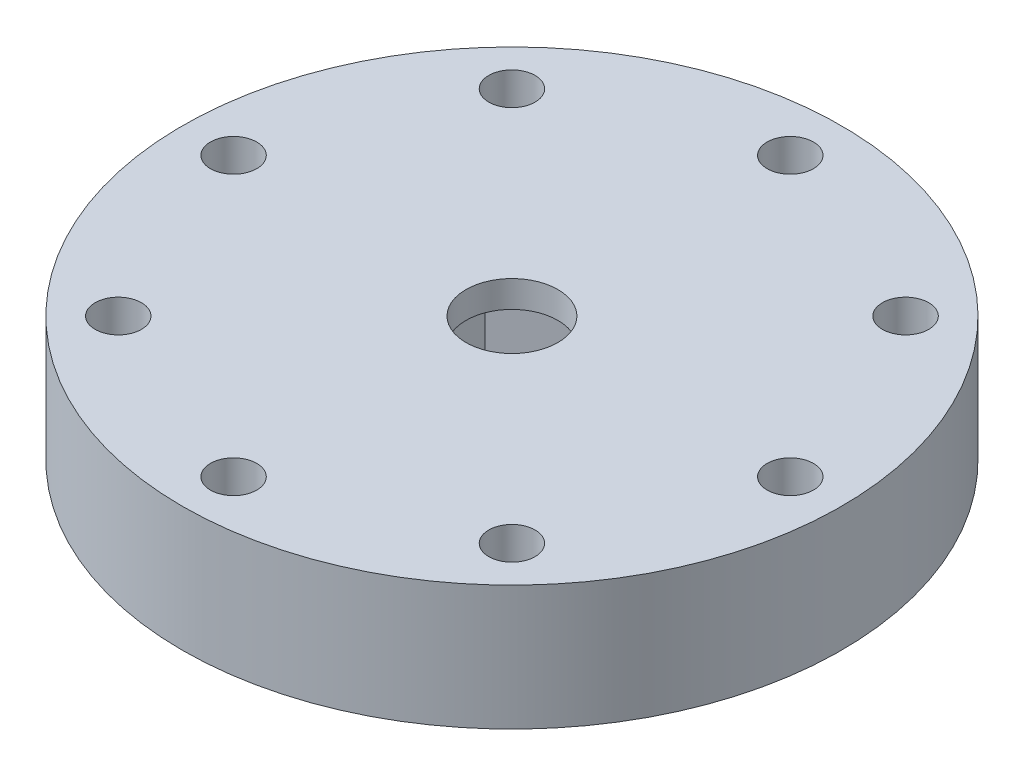
ISO-10303-21;
HEADER;
FILE_DESCRIPTION(('STEP AP214'),'2;1');
FILE_NAME('part.step','',(''),(''),'','','');
FILE_SCHEMA(('AUTOMOTIVE_DESIGN { 1 0 10303 214 1 1 1 1 }'));
ENDSEC;
DATA;
#1=APPLICATION_CONTEXT('core data for automotive mechanical design processes');
#2=APPLICATION_PROTOCOL_DEFINITION('international standard','automotive_design',2000,#1);
#3=PRODUCT_CONTEXT('',#1,'mechanical');
#4=PRODUCT('Part','Part','',(#3));
#5=PRODUCT_RELATED_PRODUCT_CATEGORY('part','',(#4));
#6=PRODUCT_DEFINITION_FORMATION('','',#4);
#7=PRODUCT_DEFINITION_CONTEXT('part definition',#1,'design');
#8=PRODUCT_DEFINITION('design','',#6,#7);
#9=PRODUCT_DEFINITION_SHAPE('','',#8);
#10=(LENGTH_UNIT() NAMED_UNIT(*) SI_UNIT(.MILLI.,.METRE.));
#11=(NAMED_UNIT(*) PLANE_ANGLE_UNIT() SI_UNIT($,.RADIAN.));
#12=(NAMED_UNIT(*) SI_UNIT($,.STERADIAN.) SOLID_ANGLE_UNIT());
#13=UNCERTAINTY_MEASURE_WITH_UNIT(LENGTH_MEASURE(1.E-05),#10,'distance_accuracy_value','');
#14=(GEOMETRIC_REPRESENTATION_CONTEXT(3) GLOBAL_UNCERTAINTY_ASSIGNED_CONTEXT((#13)) GLOBAL_UNIT_ASSIGNED_CONTEXT((#10,
#11,#12)) REPRESENTATION_CONTEXT('',''));
#15=CARTESIAN_POINT('',(0.,0.,0.));
#16=DIRECTION('',(0.,0.,1.));
#17=DIRECTION('',(1.,0.,0.));
#18=AXIS2_PLACEMENT_3D('',#15,#16,#17);
#19=CARTESIAN_POINT('',(0.,0.,0.));
#20=DIRECTION('',(0.,-1.,0.));
#21=DIRECTION('',(0.,0.,-1.));
#22=AXIS2_PLACEMENT_3D('',#19,#20,#21);
#23=CYLINDRICAL_SURFACE('',#22,5.15874);
#24=CARTESIAN_POINT('',(0.,14.,0.));
#25=DIRECTION('',(0.,-1.,0.));
#26=DIRECTION('',(0.,0.,-1.));
#27=AXIS2_PLACEMENT_3D('',#24,#25,#26);
#28=CIRCLE('',#27,5.15874);
#29=CARTESIAN_POINT('',(0.,14.,-5.15874));
#30=VERTEX_POINT('',#29);
#31=EDGE_CURVE('E158',#30,#30,#28,.T.);
#32=ORIENTED_EDGE('',*,*,#31,.F.);
#33=EDGE_LOOP('',(#32));
#34=FACE_BOUND('',#33,.T.);
#35=CARTESIAN_POINT('',(0.,11.,0.));
#36=DIRECTION('',(0.,-1.,0.));
#37=DIRECTION('',(0.,0.,-1.));
#38=AXIS2_PLACEMENT_3D('',#35,#36,#37);
#39=CIRCLE('',#38,5.15874);
#40=CARTESIAN_POINT('',(0.,11.,-5.15874));
#41=VERTEX_POINT('',#40);
#42=EDGE_CURVE('E140',#41,#41,#39,.F.);
#43=ORIENTED_EDGE('',*,*,#42,.F.);
#44=EDGE_LOOP('',(#43));
#45=FACE_BOUND('',#44,.T.);
#46=ADVANCED_FACE('F35',(#34,#45),#23,.F.);
#47=CARTESIAN_POINT('',(0.,0.,0.));
#48=DIRECTION('',(0.,1.,0.));
#49=DIRECTION('',(0.,0.,1.));
#50=AXIS2_PLACEMENT_3D('',#47,#48,#49);
#51=PLANE('',#50);
#52=CARTESIAN_POINT('',(0.,0.,0.));
#53=DIRECTION('',(0.,1.,0.));
#54=DIRECTION('',(0.,0.,1.));
#55=AXIS2_PLACEMENT_3D('',#52,#53,#54);
#56=CIRCLE('',#55,27.6);
#57=CARTESIAN_POINT('',(0.,0.,27.6));
#58=VERTEX_POINT('',#57);
#59=EDGE_CURVE('E165',#58,#58,#56,.F.);
#60=ORIENTED_EDGE('',*,*,#59,.T.);
#61=EDGE_LOOP('',(#60));
#62=FACE_BOUND('',#61,.T.);
#63=CARTESIAN_POINT('',(0.,0.,0.));
#64=DIRECTION('',(0.,-1.,0.));
#65=DIRECTION('',(0.,0.,-1.));
#66=AXIS2_PLACEMENT_3D('',#63,#64,#65);
#67=CIRCLE('',#66,22.5);
#68=CARTESIAN_POINT('',(0.,0.,-22.5));
#69=VERTEX_POINT('',#68);
#70=EDGE_CURVE('E150',#69,#69,#67,.T.);
#71=ORIENTED_EDGE('',*,*,#70,.F.);
#72=EDGE_LOOP('',(#71));
#73=FACE_BOUND('',#72,.T.);
#74=ADVANCED_FACE('F195',(#62,#73),#51,.F.);
#75=CARTESIAN_POINT('',(0.,14.,0.));
#76=DIRECTION('',(0.,1.,0.));
#77=DIRECTION('',(0.,0.,1.));
#78=AXIS2_PLACEMENT_3D('',#75,#76,#77);
#79=PLANE('',#78);
#80=CARTESIAN_POINT('',(-22.0970869120793,14.,-22.0970869120799));
#81=DIRECTION('',(0.,-1.,0.));
#82=DIRECTION('',(-0.707106781186539,0.,-0.707106781186556));
#83=AXIS2_PLACEMENT_3D('',#80,#81,#82);
#84=CIRCLE('',#83,2.6);
#85=CARTESIAN_POINT('',(-23.9355645431643,14.,-23.9355645431649));
#86=VERTEX_POINT('',#85);
#87=EDGE_CURVE('E376',#86,#86,#84,.T.);
#88=ORIENTED_EDGE('',*,*,#87,.T.);
#89=EDGE_LOOP('',(#88));
#90=FACE_BOUND('',#89,.T.);
#91=CARTESIAN_POINT('',(-31.25,14.,-3.27326375516544E-13));
#92=DIRECTION('',(0.,-1.,0.));
#93=DIRECTION('',(-1.,0.,0.));
#94=AXIS2_PLACEMENT_3D('',#91,#92,#93);
#95=CIRCLE('',#94,2.6);
#96=CARTESIAN_POINT('',(-33.85,14.,-3.5455992995952E-13));
#97=VERTEX_POINT('',#96);
#98=EDGE_CURVE('E388',#97,#97,#95,.T.);
#99=ORIENTED_EDGE('',*,*,#98,.T.);
#100=EDGE_LOOP('',(#99));
#101=FACE_BOUND('',#100,.T.);
#102=CARTESIAN_POINT('',(-22.0970869120798,14.,22.0970869120794));
#103=DIRECTION('',(0.,-1.,0.));
#104=DIRECTION('',(-0.707106781186554,0.,0.707106781186541));
#105=AXIS2_PLACEMENT_3D('',#102,#103,#104);
#106=CIRCLE('',#105,2.6);
#107=CARTESIAN_POINT('',(-23.9355645431648,14.,23.9355645431644));
#108=VERTEX_POINT('',#107);
#109=EDGE_CURVE('E400',#108,#108,#106,.T.);
#110=ORIENTED_EDGE('',*,*,#109,.T.);
#111=EDGE_LOOP('',(#110));
#112=FACE_BOUND('',#111,.T.);
#113=CARTESIAN_POINT('',(0.,14.,31.25));
#114=DIRECTION('',(0.,-1.,0.));
#115=DIRECTION('',(0.,0.,1.));
#116=AXIS2_PLACEMENT_3D('',#113,#114,#115);
#117=CIRCLE('',#116,2.6);
#118=CARTESIAN_POINT('',(0.,14.,33.85));
#119=VERTEX_POINT('',#118);
#120=EDGE_CURVE('E412',#119,#119,#117,.T.);
#121=ORIENTED_EDGE('',*,*,#120,.T.);
#122=EDGE_LOOP('',(#121));
#123=FACE_BOUND('',#122,.T.);
#124=CARTESIAN_POINT('',(22.0970869120795,14.,22.0970869120797));
#125=DIRECTION('',(0.,-1.,0.));
#126=DIRECTION('',(0.707106781186544,0.,0.707106781186551));
#127=AXIS2_PLACEMENT_3D('',#124,#125,#126);
#128=CIRCLE('',#127,2.6);
#129=CARTESIAN_POINT('',(23.9355645431645,14.,23.9355645431648));
#130=VERTEX_POINT('',#129);
#131=EDGE_CURVE('E424',#130,#130,#128,.T.);
#132=ORIENTED_EDGE('',*,*,#131,.T.);
#133=EDGE_LOOP('',(#132));
#134=FACE_BOUND('',#133,.T.);
#135=CARTESIAN_POINT('',(31.25,14.,1.09108791838848E-13));
#136=DIRECTION('',(0.,-1.,0.));
#137=DIRECTION('',(1.,0.,0.));
#138=AXIS2_PLACEMENT_3D('',#135,#136,#137);
#139=CIRCLE('',#138,2.6);
#140=CARTESIAN_POINT('',(33.85,14.,1.1818664331984E-13));
#141=VERTEX_POINT('',#140);
#142=EDGE_CURVE('E436',#141,#141,#139,.T.);
#143=ORIENTED_EDGE('',*,*,#142,.T.);
#144=EDGE_LOOP('',(#143));
#145=FACE_BOUND('',#144,.T.);
#146=CARTESIAN_POINT('',(22.0970869120797,14.,-22.0970869120796));
#147=DIRECTION('',(0.,-1.,0.));
#148=DIRECTION('',(0.707106781186549,0.,-0.707106781186546));
#149=AXIS2_PLACEMENT_3D('',#146,#147,#148);
#150=CIRCLE('',#149,2.6);
#151=CARTESIAN_POINT('',(23.9355645431647,14.,-23.9355645431646));
#152=VERTEX_POINT('',#151);
#153=EDGE_CURVE('E448',#152,#152,#150,.T.);
#154=ORIENTED_EDGE('',*,*,#153,.T.);
#155=EDGE_LOOP('',(#154));
#156=FACE_BOUND('',#155,.T.);
#157=CARTESIAN_POINT('',(0.,14.,-31.25));
#158=DIRECTION('',(0.,-1.,0.));
#159=DIRECTION('',(0.,0.,-1.));
#160=AXIS2_PLACEMENT_3D('',#157,#158,#159);
#161=CIRCLE('',#160,2.6);
#162=CARTESIAN_POINT('',(0.,14.,-33.85));
#163=VERTEX_POINT('',#162);
#164=EDGE_CURVE('E127',#163,#163,#161,.T.);
#165=ORIENTED_EDGE('',*,*,#164,.T.);
#166=EDGE_LOOP('',(#165));
#167=FACE_BOUND('',#166,.T.);
#168=ORIENTED_EDGE('',*,*,#31,.T.);
#169=EDGE_LOOP('',(#168));
#170=FACE_BOUND('',#169,.T.);
#171=CARTESIAN_POINT('',(0.,14.,0.));
#172=DIRECTION('',(0.,1.,0.));
#173=DIRECTION('',(0.,0.,1.));
#174=AXIS2_PLACEMENT_3D('',#171,#172,#173);
#175=CIRCLE('',#174,37.);
#176=CARTESIAN_POINT('',(0.,14.,37.));
#177=VERTEX_POINT('',#176);
#178=EDGE_CURVE('E162',#177,#177,#175,.T.);
#179=ORIENTED_EDGE('',*,*,#178,.T.);
#180=EDGE_LOOP('',(#179));
#181=FACE_BOUND('',#180,.T.);
#182=ADVANCED_FACE('F201',(#90,#101,#112,#123,#134,#145,#156,#167,#170,#181),#79,.T.);
#183=CARTESIAN_POINT('',(0.,0.,0.));
#184=DIRECTION('',(0.,1.,0.));
#185=DIRECTION('',(0.,0.,1.));
#186=AXIS2_PLACEMENT_3D('',#183,#184,#185);
#187=CIRCLE('',#186,34.9);
#188=CARTESIAN_POINT('',(0.,0.,34.9));
#189=VERTEX_POINT('',#188);
#190=EDGE_CURVE('E11',#189,#189,#187,.T.);
#191=ORIENTED_EDGE('',*,*,#190,.T.);
#192=EDGE_LOOP('',(#191));
#193=FACE_BOUND('',#192,.T.);
#194=CARTESIAN_POINT('',(0.,0.,0.));
#195=DIRECTION('',(0.,1.,0.));
#196=DIRECTION('',(0.,0.,1.));
#197=AXIS2_PLACEMENT_3D('',#194,#195,#196);
#198=CIRCLE('',#197,37.);
#199=CARTESIAN_POINT('',(0.,0.,37.));
#200=VERTEX_POINT('',#199);
#201=EDGE_CURVE('E161',#200,#200,#198,.T.);
#202=ORIENTED_EDGE('',*,*,#201,.F.);
#203=EDGE_LOOP('',(#202));
#204=FACE_BOUND('',#203,.T.);
#205=ADVANCED_FACE('F204',(#193,#204),#51,.F.);
#206=CARTESIAN_POINT('',(0.,14.,0.));
#207=DIRECTION('',(0.,-1.,0.));
#208=DIRECTION('',(0.,0.,-1.));
#209=AXIS2_PLACEMENT_3D('',#206,#207,#208);
#210=CYLINDRICAL_SURFACE('',#209,37.);
#211=ORIENTED_EDGE('',*,*,#178,.F.);
#212=EDGE_LOOP('',(#211));
#213=FACE_BOUND('',#212,.T.);
#214=ORIENTED_EDGE('',*,*,#201,.T.);
#215=EDGE_LOOP('',(#214));
#216=FACE_BOUND('',#215,.T.);
#217=ADVANCED_FACE('F214',(#213,#216),#210,.T.);
#218=CARTESIAN_POINT('',(0.,3.,0.));
#219=DIRECTION('',(0.,-1.,0.));
#220=DIRECTION('',(0.,0.,-1.));
#221=AXIS2_PLACEMENT_3D('',#218,#219,#220);
#222=CYLINDRICAL_SURFACE('',#221,34.1);
#223=CARTESIAN_POINT('',(0.,0.800000000000023,0.));
#224=DIRECTION('',(0.,1.,0.));
#225=DIRECTION('',(0.,0.,1.));
#226=AXIS2_PLACEMENT_3D('',#223,#224,#225);
#227=CIRCLE('',#226,34.1);
#228=CARTESIAN_POINT('',(0.,0.800000000000023,34.1));
#229=VERTEX_POINT('',#228);
#230=EDGE_CURVE('E44',#229,#229,#227,.F.);
#231=ORIENTED_EDGE('',*,*,#230,.T.);
#232=EDGE_LOOP('',(#231));
#233=FACE_BOUND('',#232,.T.);
#234=CARTESIAN_POINT('',(0.,3.,0.));
#235=DIRECTION('',(0.,-1.,0.));
#236=DIRECTION('',(0.,0.,-1.));
#237=AXIS2_PLACEMENT_3D('',#234,#235,#236);
#238=CIRCLE('',#237,34.1);
#239=CARTESIAN_POINT('',(0.,3.,-34.1));
#240=VERTEX_POINT('',#239);
#241=EDGE_CURVE('E155',#240,#240,#238,.T.);
#242=ORIENTED_EDGE('',*,*,#241,.F.);
#243=EDGE_LOOP('',(#242));
#244=FACE_BOUND('',#243,.T.);
#245=ADVANCED_FACE('F177',(#233,#244),#222,.F.);
#246=CARTESIAN_POINT('',(0.,3.,0.));
#247=DIRECTION('',(0.,-1.,0.));
#248=DIRECTION('',(0.,0.,-1.));
#249=AXIS2_PLACEMENT_3D('',#246,#247,#248);
#250=PLANE('',#249);
#251=CARTESIAN_POINT('',(-22.0970869120793,3.,-22.0970869120799));
#252=DIRECTION('',(0.,-1.,0.));
#253=DIRECTION('',(-0.707106781186539,0.,-0.707106781186556));
#254=AXIS2_PLACEMENT_3D('',#251,#252,#253);
#255=CIRCLE('',#254,1.7);
#256=CARTESIAN_POINT('',(-23.2991684400965,3.,-23.299168440097));
#257=VERTEX_POINT('',#256);
#258=EDGE_CURVE('E369',#257,#257,#255,.T.);
#259=ORIENTED_EDGE('',*,*,#258,.F.);
#260=EDGE_LOOP('',(#259));
#261=FACE_BOUND('',#260,.T.);
#262=CARTESIAN_POINT('',(-31.25,3.,-3.27326375516544E-13));
#263=DIRECTION('',(0.,-1.,0.));
#264=DIRECTION('',(-1.,0.,0.));
#265=AXIS2_PLACEMENT_3D('',#262,#263,#264);
#266=CIRCLE('',#265,1.7);
#267=CARTESIAN_POINT('',(-32.95,3.,-3.45132930344644E-13));
#268=VERTEX_POINT('',#267);
#269=EDGE_CURVE('E379',#268,#268,#266,.T.);
#270=ORIENTED_EDGE('',*,*,#269,.F.);
#271=EDGE_LOOP('',(#270));
#272=FACE_BOUND('',#271,.T.);
#273=CARTESIAN_POINT('',(-22.0970869120798,3.,22.0970869120794));
#274=DIRECTION('',(0.,-1.,0.));
#275=DIRECTION('',(-0.707106781186554,0.,0.707106781186541));
#276=AXIS2_PLACEMENT_3D('',#273,#274,#275);
#277=CIRCLE('',#276,1.7);
#278=CARTESIAN_POINT('',(-23.2991684400969,3.,23.2991684400965));
#279=VERTEX_POINT('',#278);
#280=EDGE_CURVE('E391',#279,#279,#277,.T.);
#281=ORIENTED_EDGE('',*,*,#280,.F.);
#282=EDGE_LOOP('',(#281));
#283=FACE_BOUND('',#282,.T.);
#284=CARTESIAN_POINT('',(0.,3.,31.25));
#285=DIRECTION('',(0.,-1.,0.));
#286=DIRECTION('',(0.,0.,1.));
#287=AXIS2_PLACEMENT_3D('',#284,#285,#286);
#288=CIRCLE('',#287,1.7);
#289=CARTESIAN_POINT('',(0.,3.,32.95));
#290=VERTEX_POINT('',#289);
#291=EDGE_CURVE('E403',#290,#290,#288,.T.);
#292=ORIENTED_EDGE('',*,*,#291,.F.);
#293=EDGE_LOOP('',(#292));
#294=FACE_BOUND('',#293,.T.);
#295=CARTESIAN_POINT('',(22.0970869120795,3.,22.0970869120797));
#296=DIRECTION('',(0.,-1.,0.));
#297=DIRECTION('',(0.707106781186544,0.,0.707106781186551));
#298=AXIS2_PLACEMENT_3D('',#295,#296,#297);
#299=CIRCLE('',#298,1.7);
#300=CARTESIAN_POINT('',(23.2991684400966,3.,23.2991684400969));
#301=VERTEX_POINT('',#300);
#302=EDGE_CURVE('E415',#301,#301,#299,.T.);
#303=ORIENTED_EDGE('',*,*,#302,.F.);
#304=EDGE_LOOP('',(#303));
#305=FACE_BOUND('',#304,.T.);
#306=CARTESIAN_POINT('',(31.25,3.,1.09108791838848E-13));
#307=DIRECTION('',(0.,-1.,0.));
#308=DIRECTION('',(1.,0.,0.));
#309=AXIS2_PLACEMENT_3D('',#306,#307,#308);
#310=CIRCLE('',#309,1.7);
#311=CARTESIAN_POINT('',(32.95,3.,1.15044310114881E-13));
#312=VERTEX_POINT('',#311);
#313=EDGE_CURVE('E427',#312,#312,#310,.T.);
#314=ORIENTED_EDGE('',*,*,#313,.F.);
#315=EDGE_LOOP('',(#314));
#316=FACE_BOUND('',#315,.T.);
#317=CARTESIAN_POINT('',(22.0970869120797,3.,-22.0970869120796));
#318=DIRECTION('',(0.,-1.,0.));
#319=DIRECTION('',(0.707106781186549,0.,-0.707106781186546));
#320=AXIS2_PLACEMENT_3D('',#317,#318,#319);
#321=CIRCLE('',#320,1.7);
#322=CARTESIAN_POINT('',(23.2991684400968,3.,-23.2991684400967));
#323=VERTEX_POINT('',#322);
#324=EDGE_CURVE('E439',#323,#323,#321,.T.);
#325=ORIENTED_EDGE('',*,*,#324,.F.);
#326=EDGE_LOOP('',(#325));
#327=FACE_BOUND('',#326,.T.);
#328=CARTESIAN_POINT('',(0.,3.,-31.25));
#329=DIRECTION('',(0.,-1.,0.));
#330=DIRECTION('',(0.,0.,-1.));
#331=AXIS2_PLACEMENT_3D('',#328,#329,#330);
#332=CIRCLE('',#331,1.7);
#333=CARTESIAN_POINT('',(0.,3.,-32.95));
#334=VERTEX_POINT('',#333);
#335=EDGE_CURVE('E451',#334,#334,#332,.T.);
#336=ORIENTED_EDGE('',*,*,#335,.F.);
#337=EDGE_LOOP('',(#336));
#338=FACE_BOUND('',#337,.T.);
#339=CARTESIAN_POINT('',(0.,3.,0.));
#340=DIRECTION('',(0.,-1.,0.));
#341=DIRECTION('',(0.,0.,-1.));
#342=AXIS2_PLACEMENT_3D('',#339,#340,#341);
#343=CIRCLE('',#342,28.4);
#344=CARTESIAN_POINT('',(0.,3.,-28.4));
#345=VERTEX_POINT('',#344);
#346=EDGE_CURVE('E149',#345,#345,#343,.T.);
#347=ORIENTED_EDGE('',*,*,#346,.F.);
#348=EDGE_LOOP('',(#347));
#349=FACE_BOUND('',#348,.T.);
#350=ORIENTED_EDGE('',*,*,#241,.T.);
#351=EDGE_LOOP('',(#350));
#352=FACE_BOUND('',#351,.T.);
#353=ADVANCED_FACE('F226',(#261,#272,#283,#294,#305,#316,#327,#338,#349,#352),#250,.T.);
#354=CARTESIAN_POINT('',(0.,3.,0.));
#355=DIRECTION('',(0.,-1.,0.));
#356=DIRECTION('',(0.,0.,-1.));
#357=AXIS2_PLACEMENT_3D('',#354,#355,#356);
#358=CYLINDRICAL_SURFACE('',#357,28.4);
#359=CARTESIAN_POINT('',(0.,0.800000000000012,0.));
#360=DIRECTION('',(0.,1.,0.));
#361=DIRECTION('',(0.,0.,1.));
#362=AXIS2_PLACEMENT_3D('',#359,#360,#361);
#363=CIRCLE('',#362,28.4);
#364=CARTESIAN_POINT('',(0.,0.800000000000012,28.4));
#365=VERTEX_POINT('',#364);
#366=EDGE_CURVE('E172',#365,#365,#363,.T.);
#367=ORIENTED_EDGE('',*,*,#366,.T.);
#368=EDGE_LOOP('',(#367));
#369=FACE_BOUND('',#368,.T.);
#370=ORIENTED_EDGE('',*,*,#346,.T.);
#371=EDGE_LOOP('',(#370));
#372=FACE_BOUND('',#371,.T.);
#373=ADVANCED_FACE('F235',(#369,#372),#358,.T.);
#374=CARTESIAN_POINT('',(0.,5.,0.));
#375=DIRECTION('',(0.,-1.,0.));
#376=DIRECTION('',(0.,0.,-1.));
#377=AXIS2_PLACEMENT_3D('',#374,#375,#376);
#378=PLANE('',#377);
#379=DIRECTION('',(-0.866025403784439,0.,0.5));
#380=VECTOR('',#379,1.);
#381=CARTESIAN_POINT('',(7.14375,5.,4.12444598552339));
#382=LINE('',#381,#380);
#383=CARTESIAN_POINT('',(7.14375,5.,4.12444598552339));
#384=VERTEX_POINT('',#383);
#385=CARTESIAN_POINT('',(0.,5.,8.24889197104678));
#386=VERTEX_POINT('',#385);
#387=EDGE_CURVE('E51',#384,#386,#382,.T.);
#388=ORIENTED_EDGE('',*,*,#387,.F.);
#389=DIRECTION('',(0.,0.,1.));
#390=VECTOR('',#389,1.);
#391=CARTESIAN_POINT('',(7.14375,5.,-4.1244459855234));
#392=LINE('',#391,#390);
#393=CARTESIAN_POINT('',(7.14375,5.,-4.1244459855234));
#394=VERTEX_POINT('',#393);
#395=EDGE_CURVE('E136',#394,#384,#392,.T.);
#396=ORIENTED_EDGE('',*,*,#395,.F.);
#397=DIRECTION('',(0.866025403784439,0.,0.5));
#398=VECTOR('',#397,1.);
#399=CARTESIAN_POINT('',(0.,5.,-8.24889197104678));
#400=LINE('',#399,#398);
#401=CARTESIAN_POINT('',(0.,5.,-8.24889197104678));
#402=VERTEX_POINT('',#401);
#403=EDGE_CURVE('E134',#402,#394,#400,.T.);
#404=ORIENTED_EDGE('',*,*,#403,.F.);
#405=DIRECTION('',(0.866025403784438,0.,-0.5));
#406=VECTOR('',#405,1.);
#407=CARTESIAN_POINT('',(-7.14375,5.,-4.12444598552339));
#408=LINE('',#407,#406);
#409=CARTESIAN_POINT('',(-7.14375,5.,-4.12444598552339));
#410=VERTEX_POINT('',#409);
#411=EDGE_CURVE('E99',#410,#402,#408,.T.);
#412=ORIENTED_EDGE('',*,*,#411,.F.);
#413=DIRECTION('',(0.,0.,-1.));
#414=VECTOR('',#413,1.);
#415=CARTESIAN_POINT('',(-7.14375,5.,4.12444598552339));
#416=LINE('',#415,#414);
#417=CARTESIAN_POINT('',(-7.14375,5.,4.12444598552339));
#418=VERTEX_POINT('',#417);
#419=EDGE_CURVE('E130',#418,#410,#416,.T.);
#420=ORIENTED_EDGE('',*,*,#419,.F.);
#421=DIRECTION('',(-0.866025403784439,0.,-0.5));
#422=VECTOR('',#421,1.);
#423=CARTESIAN_POINT('',(0.,5.,8.24889197104678));
#424=LINE('',#423,#422);
#425=EDGE_CURVE('E126',#386,#418,#424,.T.);
#426=ORIENTED_EDGE('',*,*,#425,.F.);
#427=EDGE_LOOP('',(#388,#396,#404,#412,#420,#426));
#428=FACE_BOUND('',#427,.T.);
#429=CARTESIAN_POINT('',(0.,5.,0.));
#430=DIRECTION('',(0.,-1.,0.));
#431=DIRECTION('',(0.,0.,-1.));
#432=AXIS2_PLACEMENT_3D('',#429,#430,#431);
#433=CIRCLE('',#432,22.5);
#434=CARTESIAN_POINT('',(0.,5.,-22.5));
#435=VERTEX_POINT('',#434);
#436=EDGE_CURVE('E146',#435,#435,#433,.T.);
#437=ORIENTED_EDGE('',*,*,#436,.T.);
#438=EDGE_LOOP('',(#437));
#439=FACE_BOUND('',#438,.T.);
#440=ADVANCED_FACE('F240',(#428,#439),#378,.T.);
#441=CARTESIAN_POINT('',(0.,5.,0.));
#442=DIRECTION('',(0.,-1.,0.));
#443=DIRECTION('',(0.,0.,-1.));
#444=AXIS2_PLACEMENT_3D('',#441,#442,#443);
#445=CYLINDRICAL_SURFACE('',#444,22.5);
#446=ORIENTED_EDGE('',*,*,#436,.F.);
#447=EDGE_LOOP('',(#446));
#448=FACE_BOUND('',#447,.T.);
#449=ORIENTED_EDGE('',*,*,#70,.T.);
#450=EDGE_LOOP('',(#449));
#451=FACE_BOUND('',#450,.T.);
#452=ADVANCED_FACE('F246',(#448,#451),#445,.F.);
#453=CARTESIAN_POINT('',(0.,11.,0.));
#454=DIRECTION('',(0.,-1.,0.));
#455=DIRECTION('',(0.,0.,-1.));
#456=AXIS2_PLACEMENT_3D('',#453,#454,#455);
#457=PLANE('',#456);
#458=DIRECTION('',(-0.866025403784439,0.,0.5));
#459=VECTOR('',#458,1.);
#460=CARTESIAN_POINT('',(7.14375,11.,4.12444598552339));
#461=LINE('',#460,#459);
#462=CARTESIAN_POINT('',(7.14375,11.,4.12444598552339));
#463=VERTEX_POINT('',#462);
#464=CARTESIAN_POINT('',(0.,11.,8.24889197104678));
#465=VERTEX_POINT('',#464);
#466=EDGE_CURVE('E138',#463,#465,#461,.T.);
#467=ORIENTED_EDGE('',*,*,#466,.T.);
#468=DIRECTION('',(-0.866025403784439,0.,-0.5));
#469=VECTOR('',#468,1.);
#470=CARTESIAN_POINT('',(0.,11.,8.24889197104678));
#471=LINE('',#470,#469);
#472=CARTESIAN_POINT('',(-7.14375,11.,4.12444598552339));
#473=VERTEX_POINT('',#472);
#474=EDGE_CURVE('E120',#465,#473,#471,.T.);
#475=ORIENTED_EDGE('',*,*,#474,.T.);
#476=DIRECTION('',(0.,0.,-1.));
#477=VECTOR('',#476,1.);
#478=CARTESIAN_POINT('',(-7.14375,11.,4.12444598552339));
#479=LINE('',#478,#477);
#480=CARTESIAN_POINT('',(-7.14375,11.,-4.12444598552339));
#481=VERTEX_POINT('',#480);
#482=EDGE_CURVE('E118',#473,#481,#479,.T.);
#483=ORIENTED_EDGE('',*,*,#482,.T.);
#484=DIRECTION('',(0.866025403784438,0.,-0.5));
#485=VECTOR('',#484,1.);
#486=CARTESIAN_POINT('',(-7.14375,11.,-4.12444598552339));
#487=LINE('',#486,#485);
#488=CARTESIAN_POINT('',(0.,11.,-8.24889197104678));
#489=VERTEX_POINT('',#488);
#490=EDGE_CURVE('E96',#481,#489,#487,.T.);
#491=ORIENTED_EDGE('',*,*,#490,.T.);
#492=DIRECTION('',(0.866025403784439,0.,0.5));
#493=VECTOR('',#492,1.);
#494=CARTESIAN_POINT('',(0.,11.,-8.24889197104678));
#495=LINE('',#494,#493);
#496=CARTESIAN_POINT('',(7.14375,11.,-4.1244459855234));
#497=VERTEX_POINT('',#496);
#498=EDGE_CURVE('E107',#489,#497,#495,.T.);
#499=ORIENTED_EDGE('',*,*,#498,.T.);
#500=DIRECTION('',(0.,0.,1.));
#501=VECTOR('',#500,1.);
#502=CARTESIAN_POINT('',(7.14375,11.,-4.1244459855234));
#503=LINE('',#502,#501);
#504=EDGE_CURVE('E111',#497,#463,#503,.T.);
#505=ORIENTED_EDGE('',*,*,#504,.T.);
#506=EDGE_LOOP('',(#467,#475,#483,#491,#499,#505));
#507=FACE_BOUND('',#506,.T.);
#508=ORIENTED_EDGE('',*,*,#42,.T.);
#509=EDGE_LOOP('',(#508));
#510=FACE_BOUND('',#509,.T.);
#511=ADVANCED_FACE('F114',(#507,#510),#457,.T.);
#512=CARTESIAN_POINT('',(7.14375,11.,4.12444598552339));
#513=DIRECTION('',(0.5,0.,0.866025403784438));
#514=DIRECTION('',(0.866025403784439,0.,-0.5));
#515=AXIS2_PLACEMENT_3D('',#512,#513,#514);
#516=PLANE('',#515);
#517=ORIENTED_EDGE('',*,*,#387,.T.);
#518=DIRECTION('',(0.,-1.,0.));
#519=VECTOR('',#518,1.);
#520=CARTESIAN_POINT('',(0.,11.,8.24889197104678));
#521=LINE('',#520,#519);
#522=EDGE_CURVE('E81',#465,#386,#521,.T.);
#523=ORIENTED_EDGE('',*,*,#522,.F.);
#524=ORIENTED_EDGE('',*,*,#466,.F.);
#525=DIRECTION('',(0.,-1.,0.));
#526=VECTOR('',#525,1.);
#527=CARTESIAN_POINT('',(7.14375,11.,4.12444598552339));
#528=LINE('',#527,#526);
#529=EDGE_CURVE('E59',#463,#384,#528,.T.);
#530=ORIENTED_EDGE('',*,*,#529,.T.);
#531=EDGE_LOOP('',(#517,#523,#524,#530));
#532=FACE_BOUND('',#531,.T.);
#533=ADVANCED_FACE('F253',(#532),#516,.F.);
#534=CARTESIAN_POINT('',(7.14375,11.,-4.1244459855234));
#535=DIRECTION('',(1.,0.,0.));
#536=DIRECTION('',(0.,0.,-1.));
#537=AXIS2_PLACEMENT_3D('',#534,#535,#536);
#538=PLANE('',#537);
#539=ORIENTED_EDGE('',*,*,#395,.T.);
#540=ORIENTED_EDGE('',*,*,#529,.F.);
#541=ORIENTED_EDGE('',*,*,#504,.F.);
#542=DIRECTION('',(0.,-1.,0.));
#543=VECTOR('',#542,1.);
#544=CARTESIAN_POINT('',(7.14375,11.,-4.1244459855234));
#545=LINE('',#544,#543);
#546=EDGE_CURVE('E103',#497,#394,#545,.T.);
#547=ORIENTED_EDGE('',*,*,#546,.T.);
#548=EDGE_LOOP('',(#539,#540,#541,#547));
#549=FACE_BOUND('',#548,.T.);
#550=ADVANCED_FACE('F256',(#549),#538,.F.);
#551=CARTESIAN_POINT('',(0.,11.,-8.24889197104678));
#552=DIRECTION('',(0.5,0.,-0.866025403784439));
#553=DIRECTION('',(-0.866025403784439,0.,-0.5));
#554=AXIS2_PLACEMENT_3D('',#551,#552,#553);
#555=PLANE('',#554);
#556=ORIENTED_EDGE('',*,*,#403,.T.);
#557=ORIENTED_EDGE('',*,*,#546,.F.);
#558=ORIENTED_EDGE('',*,*,#498,.F.);
#559=DIRECTION('',(0.,-1.,0.));
#560=VECTOR('',#559,1.);
#561=CARTESIAN_POINT('',(0.,11.,-8.24889197104678));
#562=LINE('',#561,#560);
#563=EDGE_CURVE('E92',#489,#402,#562,.T.);
#564=ORIENTED_EDGE('',*,*,#563,.T.);
#565=EDGE_LOOP('',(#556,#557,#558,#564));
#566=FACE_BOUND('',#565,.T.);
#567=ADVANCED_FACE('F108',(#566),#555,.F.);
#568=CARTESIAN_POINT('',(-7.14375,11.,-4.12444598552339));
#569=DIRECTION('',(-0.5,0.,-0.866025403784438));
#570=DIRECTION('',(-0.866025403784439,0.,0.5));
#571=AXIS2_PLACEMENT_3D('',#568,#569,#570);
#572=PLANE('',#571);
#573=ORIENTED_EDGE('',*,*,#411,.T.);
#574=ORIENTED_EDGE('',*,*,#563,.F.);
#575=ORIENTED_EDGE('',*,*,#490,.F.);
#576=DIRECTION('',(0.,-1.,0.));
#577=VECTOR('',#576,1.);
#578=CARTESIAN_POINT('',(-7.14375,11.,-4.12444598552339));
#579=LINE('',#578,#577);
#580=EDGE_CURVE('E104',#481,#410,#579,.T.);
#581=ORIENTED_EDGE('',*,*,#580,.T.);
#582=EDGE_LOOP('',(#573,#574,#575,#581));
#583=FACE_BOUND('',#582,.T.);
#584=ADVANCED_FACE('F94',(#583),#572,.F.);
#585=CARTESIAN_POINT('',(-7.14375,11.,4.12444598552339));
#586=DIRECTION('',(-1.,0.,0.));
#587=DIRECTION('',(0.,0.,1.));
#588=AXIS2_PLACEMENT_3D('',#585,#586,#587);
#589=PLANE('',#588);
#590=ORIENTED_EDGE('',*,*,#419,.T.);
#591=ORIENTED_EDGE('',*,*,#580,.F.);
#592=ORIENTED_EDGE('',*,*,#482,.F.);
#593=DIRECTION('',(0.,-1.,0.));
#594=VECTOR('',#593,1.);
#595=CARTESIAN_POINT('',(-7.14375,11.,4.12444598552339));
#596=LINE('',#595,#594);
#597=EDGE_CURVE('E143',#473,#418,#596,.T.);
#598=ORIENTED_EDGE('',*,*,#597,.T.);
#599=EDGE_LOOP('',(#590,#591,#592,#598));
#600=FACE_BOUND('',#599,.T.);
#601=ADVANCED_FACE('F259',(#600),#589,.F.);
#602=CARTESIAN_POINT('',(0.,11.,8.24889197104678));
#603=DIRECTION('',(-0.5,0.,0.866025403784438));
#604=DIRECTION('',(0.866025403784439,0.,0.5));
#605=AXIS2_PLACEMENT_3D('',#602,#603,#604);
#606=PLANE('',#605);
#607=ORIENTED_EDGE('',*,*,#425,.T.);
#608=ORIENTED_EDGE('',*,*,#597,.F.);
#609=ORIENTED_EDGE('',*,*,#474,.F.);
#610=ORIENTED_EDGE('',*,*,#522,.T.);
#611=EDGE_LOOP('',(#607,#608,#609,#610));
#612=FACE_BOUND('',#611,.T.);
#613=ADVANCED_FACE('F191',(#612),#606,.F.);
#614=CARTESIAN_POINT('',(0.,0.,0.));
#615=DIRECTION('',(0.,1.,0.));
#616=DIRECTION('',(0.,0.,1.));
#617=AXIS2_PLACEMENT_3D('',#614,#615,#616);
#618=CONICAL_SURFACE('',#617,27.6,0.78539816339744);
#619=ORIENTED_EDGE('',*,*,#366,.F.);
#620=EDGE_LOOP('',(#619));
#621=FACE_BOUND('',#620,.T.);
#622=ORIENTED_EDGE('',*,*,#59,.F.);
#623=EDGE_LOOP('',(#622));
#624=FACE_BOUND('',#623,.T.);
#625=ADVANCED_FACE('F182',(#621,#624),#618,.T.);
#626=CARTESIAN_POINT('',(0.,0.800000000000023,0.));
#627=DIRECTION('',(0.,-1.,0.));
#628=DIRECTION('',(0.,0.,-1.));
#629=AXIS2_PLACEMENT_3D('',#626,#627,#628);
#630=CONICAL_SURFACE('',#629,34.1,0.785398163397453);
#631=ORIENTED_EDGE('',*,*,#190,.F.);
#632=EDGE_LOOP('',(#631));
#633=FACE_BOUND('',#632,.T.);
#634=ORIENTED_EDGE('',*,*,#230,.F.);
#635=EDGE_LOOP('',(#634));
#636=FACE_BOUND('',#635,.T.);
#637=ADVANCED_FACE('F38',(#633,#636),#630,.F.);
#638=CARTESIAN_POINT('',(0.,14.,-31.25));
#639=DIRECTION('',(0.,-1.,0.));
#640=DIRECTION('',(0.,0.,-1.));
#641=AXIS2_PLACEMENT_3D('',#638,#639,#640);
#642=CYLINDRICAL_SURFACE('',#641,2.6);
#643=ORIENTED_EDGE('',*,*,#164,.F.);
#644=EDGE_LOOP('',(#643));
#645=FACE_BOUND('',#644,.T.);
#646=CARTESIAN_POINT('',(0.,4.6,-31.25));
#647=DIRECTION('',(0.,-1.,0.));
#648=DIRECTION('',(0.,0.,-1.));
#649=AXIS2_PLACEMENT_3D('',#646,#647,#648);
#650=CIRCLE('',#649,2.6);
#651=CARTESIAN_POINT('',(0.,4.6,-33.85));
#652=VERTEX_POINT('',#651);
#653=EDGE_CURVE('E457',#652,#652,#650,.T.);
#654=ORIENTED_EDGE('',*,*,#653,.T.);
#655=EDGE_LOOP('',(#654));
#656=FACE_BOUND('',#655,.T.);
#657=ADVANCED_FACE('F181',(#645,#656),#642,.F.);
#658=CARTESIAN_POINT('',(0.,4.6,-33.85));
#659=DIRECTION('',(0.,-1.,0.));
#660=DIRECTION('',(0.,0.,-1.));
#661=AXIS2_PLACEMENT_3D('',#658,#659,#660);
#662=PLANE('',#661);
#663=ORIENTED_EDGE('',*,*,#653,.F.);
#664=EDGE_LOOP('',(#663));
#665=FACE_BOUND('',#664,.T.);
#666=CARTESIAN_POINT('',(0.,4.6,-31.25));
#667=DIRECTION('',(0.,-1.,0.));
#668=DIRECTION('',(0.,0.,-1.));
#669=AXIS2_PLACEMENT_3D('',#666,#667,#668);
#670=CIRCLE('',#669,1.7);
#671=CARTESIAN_POINT('',(0.,4.6,-32.95));
#672=VERTEX_POINT('',#671);
#673=EDGE_CURVE('E454',#672,#672,#670,.T.);
#674=ORIENTED_EDGE('',*,*,#673,.T.);
#675=EDGE_LOOP('',(#674));
#676=FACE_BOUND('',#675,.T.);
#677=ADVANCED_FACE('F188',(#665,#676),#662,.F.);
#678=CARTESIAN_POINT('',(0.,14.,-31.25));
#679=DIRECTION('',(0.,-1.,0.));
#680=DIRECTION('',(0.,0.,-1.));
#681=AXIS2_PLACEMENT_3D('',#678,#679,#680);
#682=CYLINDRICAL_SURFACE('',#681,1.7);
#683=ORIENTED_EDGE('',*,*,#673,.F.);
#684=EDGE_LOOP('',(#683));
#685=FACE_BOUND('',#684,.T.);
#686=ORIENTED_EDGE('',*,*,#335,.T.);
#687=EDGE_LOOP('',(#686));
#688=FACE_BOUND('',#687,.T.);
#689=ADVANCED_FACE('F274',(#685,#688),#682,.F.);
#690=CARTESIAN_POINT('',(22.0970869120797,14.,-22.0970869120796));
#691=DIRECTION('',(0.,-1.,0.));
#692=DIRECTION('',(0.707106781186549,0.,-0.707106781186546));
#693=AXIS2_PLACEMENT_3D('',#690,#691,#692);
#694=CYLINDRICAL_SURFACE('',#693,2.6);
#695=ORIENTED_EDGE('',*,*,#153,.F.);
#696=EDGE_LOOP('',(#695));
#697=FACE_BOUND('',#696,.T.);
#698=CARTESIAN_POINT('',(22.0970869120797,4.6,-22.0970869120796));
#699=DIRECTION('',(0.,-1.,0.));
#700=DIRECTION('',(0.707106781186549,0.,-0.707106781186546));
#701=AXIS2_PLACEMENT_3D('',#698,#699,#700);
#702=CIRCLE('',#701,2.6);
#703=CARTESIAN_POINT('',(23.9355645431647,4.6,-23.9355645431646));
#704=VERTEX_POINT('',#703);
#705=EDGE_CURVE('E445',#704,#704,#702,.T.);
#706=ORIENTED_EDGE('',*,*,#705,.T.);
#707=EDGE_LOOP('',(#706));
#708=FACE_BOUND('',#707,.T.);
#709=ADVANCED_FACE('F278',(#697,#708),#694,.F.);
#710=CARTESIAN_POINT('',(23.9355645431647,4.6,-23.9355645431646));
#711=DIRECTION('',(0.,-1.,0.));
#712=DIRECTION('',(0.707106781186549,0.,-0.707106781186546));
#713=AXIS2_PLACEMENT_3D('',#710,#711,#712);
#714=PLANE('',#713);
#715=ORIENTED_EDGE('',*,*,#705,.F.);
#716=EDGE_LOOP('',(#715));
#717=FACE_BOUND('',#716,.T.);
#718=CARTESIAN_POINT('',(22.0970869120797,4.6,-22.0970869120796));
#719=DIRECTION('',(0.,-1.,0.));
#720=DIRECTION('',(0.707106781186549,0.,-0.707106781186546));
#721=AXIS2_PLACEMENT_3D('',#718,#719,#720);
#722=CIRCLE('',#721,1.7);
#723=CARTESIAN_POINT('',(23.2991684400968,4.6,-23.2991684400967));
#724=VERTEX_POINT('',#723);
#725=EDGE_CURVE('E442',#724,#724,#722,.T.);
#726=ORIENTED_EDGE('',*,*,#725,.T.);
#727=EDGE_LOOP('',(#726));
#728=FACE_BOUND('',#727,.T.);
#729=ADVANCED_FACE('F282',(#717,#728),#714,.F.);
#730=CARTESIAN_POINT('',(22.0970869120797,14.,-22.0970869120796));
#731=DIRECTION('',(0.,-1.,0.));
#732=DIRECTION('',(0.707106781186549,0.,-0.707106781186546));
#733=AXIS2_PLACEMENT_3D('',#730,#731,#732);
#734=CYLINDRICAL_SURFACE('',#733,1.7);
#735=ORIENTED_EDGE('',*,*,#725,.F.);
#736=EDGE_LOOP('',(#735));
#737=FACE_BOUND('',#736,.T.);
#738=ORIENTED_EDGE('',*,*,#324,.T.);
#739=EDGE_LOOP('',(#738));
#740=FACE_BOUND('',#739,.T.);
#741=ADVANCED_FACE('F286',(#737,#740),#734,.F.);
#742=CARTESIAN_POINT('',(31.25,14.,1.09108791838848E-13));
#743=DIRECTION('',(0.,-1.,0.));
#744=DIRECTION('',(1.,0.,0.));
#745=AXIS2_PLACEMENT_3D('',#742,#743,#744);
#746=CYLINDRICAL_SURFACE('',#745,2.6);
#747=ORIENTED_EDGE('',*,*,#142,.F.);
#748=EDGE_LOOP('',(#747));
#749=FACE_BOUND('',#748,.T.);
#750=CARTESIAN_POINT('',(31.25,4.6,1.09108791838848E-13));
#751=DIRECTION('',(0.,-1.,0.));
#752=DIRECTION('',(1.,0.,0.));
#753=AXIS2_PLACEMENT_3D('',#750,#751,#752);
#754=CIRCLE('',#753,2.6);
#755=CARTESIAN_POINT('',(33.85,4.6,1.1818664331984E-13));
#756=VERTEX_POINT('',#755);
#757=EDGE_CURVE('E433',#756,#756,#754,.T.);
#758=ORIENTED_EDGE('',*,*,#757,.T.);
#759=EDGE_LOOP('',(#758));
#760=FACE_BOUND('',#759,.T.);
#761=ADVANCED_FACE('F290',(#749,#760),#746,.F.);
#762=CARTESIAN_POINT('',(33.85,4.6,1.1818664331984E-13));
#763=DIRECTION('',(0.,-1.,0.));
#764=DIRECTION('',(1.,0.,0.));
#765=AXIS2_PLACEMENT_3D('',#762,#763,#764);
#766=PLANE('',#765);
#767=ORIENTED_EDGE('',*,*,#757,.F.);
#768=EDGE_LOOP('',(#767));
#769=FACE_BOUND('',#768,.T.);
#770=CARTESIAN_POINT('',(31.25,4.6,1.09108791838848E-13));
#771=DIRECTION('',(0.,-1.,0.));
#772=DIRECTION('',(1.,0.,0.));
#773=AXIS2_PLACEMENT_3D('',#770,#771,#772);
#774=CIRCLE('',#773,1.7);
#775=CARTESIAN_POINT('',(32.95,4.6,1.15044310114881E-13));
#776=VERTEX_POINT('',#775);
#777=EDGE_CURVE('E430',#776,#776,#774,.T.);
#778=ORIENTED_EDGE('',*,*,#777,.T.);
#779=EDGE_LOOP('',(#778));
#780=FACE_BOUND('',#779,.T.);
#781=ADVANCED_FACE('F294',(#769,#780),#766,.F.);
#782=CARTESIAN_POINT('',(31.25,14.,1.09108791838848E-13));
#783=DIRECTION('',(0.,-1.,0.));
#784=DIRECTION('',(1.,0.,0.));
#785=AXIS2_PLACEMENT_3D('',#782,#783,#784);
#786=CYLINDRICAL_SURFACE('',#785,1.7);
#787=ORIENTED_EDGE('',*,*,#777,.F.);
#788=EDGE_LOOP('',(#787));
#789=FACE_BOUND('',#788,.T.);
#790=ORIENTED_EDGE('',*,*,#313,.T.);
#791=EDGE_LOOP('',(#790));
#792=FACE_BOUND('',#791,.T.);
#793=ADVANCED_FACE('F298',(#789,#792),#786,.F.);
#794=CARTESIAN_POINT('',(22.0970869120795,14.,22.0970869120797));
#795=DIRECTION('',(0.,-1.,0.));
#796=DIRECTION('',(0.707106781186544,0.,0.707106781186551));
#797=AXIS2_PLACEMENT_3D('',#794,#795,#796);
#798=CYLINDRICAL_SURFACE('',#797,2.6);
#799=ORIENTED_EDGE('',*,*,#131,.F.);
#800=EDGE_LOOP('',(#799));
#801=FACE_BOUND('',#800,.T.);
#802=CARTESIAN_POINT('',(22.0970869120795,4.6,22.0970869120797));
#803=DIRECTION('',(0.,-1.,0.));
#804=DIRECTION('',(0.707106781186544,0.,0.707106781186551));
#805=AXIS2_PLACEMENT_3D('',#802,#803,#804);
#806=CIRCLE('',#805,2.6);
#807=CARTESIAN_POINT('',(23.9355645431645,4.6,23.9355645431648));
#808=VERTEX_POINT('',#807);
#809=EDGE_CURVE('E421',#808,#808,#806,.T.);
#810=ORIENTED_EDGE('',*,*,#809,.T.);
#811=EDGE_LOOP('',(#810));
#812=FACE_BOUND('',#811,.T.);
#813=ADVANCED_FACE('F302',(#801,#812),#798,.F.);
#814=CARTESIAN_POINT('',(23.9355645431645,4.6,23.9355645431648));
#815=DIRECTION('',(0.,-1.,0.));
#816=DIRECTION('',(0.707106781186544,0.,0.707106781186551));
#817=AXIS2_PLACEMENT_3D('',#814,#815,#816);
#818=PLANE('',#817);
#819=ORIENTED_EDGE('',*,*,#809,.F.);
#820=EDGE_LOOP('',(#819));
#821=FACE_BOUND('',#820,.T.);
#822=CARTESIAN_POINT('',(22.0970869120795,4.6,22.0970869120797));
#823=DIRECTION('',(0.,-1.,0.));
#824=DIRECTION('',(0.707106781186544,0.,0.707106781186551));
#825=AXIS2_PLACEMENT_3D('',#822,#823,#824);
#826=CIRCLE('',#825,1.7);
#827=CARTESIAN_POINT('',(23.2991684400966,4.6,23.2991684400969));
#828=VERTEX_POINT('',#827);
#829=EDGE_CURVE('E418',#828,#828,#826,.T.);
#830=ORIENTED_EDGE('',*,*,#829,.T.);
#831=EDGE_LOOP('',(#830));
#832=FACE_BOUND('',#831,.T.);
#833=ADVANCED_FACE('F306',(#821,#832),#818,.F.);
#834=CARTESIAN_POINT('',(22.0970869120795,14.,22.0970869120797));
#835=DIRECTION('',(0.,-1.,0.));
#836=DIRECTION('',(0.707106781186544,0.,0.707106781186551));
#837=AXIS2_PLACEMENT_3D('',#834,#835,#836);
#838=CYLINDRICAL_SURFACE('',#837,1.7);
#839=ORIENTED_EDGE('',*,*,#829,.F.);
#840=EDGE_LOOP('',(#839));
#841=FACE_BOUND('',#840,.T.);
#842=ORIENTED_EDGE('',*,*,#302,.T.);
#843=EDGE_LOOP('',(#842));
#844=FACE_BOUND('',#843,.T.);
#845=ADVANCED_FACE('F310',(#841,#844),#838,.F.);
#846=CARTESIAN_POINT('',(0.,14.,31.25));
#847=DIRECTION('',(0.,-1.,0.));
#848=DIRECTION('',(0.,0.,1.));
#849=AXIS2_PLACEMENT_3D('',#846,#847,#848);
#850=CYLINDRICAL_SURFACE('',#849,2.6);
#851=ORIENTED_EDGE('',*,*,#120,.F.);
#852=EDGE_LOOP('',(#851));
#853=FACE_BOUND('',#852,.T.);
#854=CARTESIAN_POINT('',(0.,4.6,31.25));
#855=DIRECTION('',(0.,-1.,0.));
#856=DIRECTION('',(0.,0.,1.));
#857=AXIS2_PLACEMENT_3D('',#854,#855,#856);
#858=CIRCLE('',#857,2.6);
#859=CARTESIAN_POINT('',(0.,4.6,33.85));
#860=VERTEX_POINT('',#859);
#861=EDGE_CURVE('E409',#860,#860,#858,.T.);
#862=ORIENTED_EDGE('',*,*,#861,.T.);
#863=EDGE_LOOP('',(#862));
#864=FACE_BOUND('',#863,.T.);
#865=ADVANCED_FACE('F314',(#853,#864),#850,.F.);
#866=CARTESIAN_POINT('',(0.,4.6,33.85));
#867=DIRECTION('',(0.,-1.,0.));
#868=DIRECTION('',(0.,0.,1.));
#869=AXIS2_PLACEMENT_3D('',#866,#867,#868);
#870=PLANE('',#869);
#871=ORIENTED_EDGE('',*,*,#861,.F.);
#872=EDGE_LOOP('',(#871));
#873=FACE_BOUND('',#872,.T.);
#874=CARTESIAN_POINT('',(0.,4.6,31.25));
#875=DIRECTION('',(0.,-1.,0.));
#876=DIRECTION('',(0.,0.,1.));
#877=AXIS2_PLACEMENT_3D('',#874,#875,#876);
#878=CIRCLE('',#877,1.7);
#879=CARTESIAN_POINT('',(0.,4.6,32.95));
#880=VERTEX_POINT('',#879);
#881=EDGE_CURVE('E406',#880,#880,#878,.T.);
#882=ORIENTED_EDGE('',*,*,#881,.T.);
#883=EDGE_LOOP('',(#882));
#884=FACE_BOUND('',#883,.T.);
#885=ADVANCED_FACE('F318',(#873,#884),#870,.F.);
#886=CARTESIAN_POINT('',(0.,14.,31.25));
#887=DIRECTION('',(0.,-1.,0.));
#888=DIRECTION('',(0.,0.,1.));
#889=AXIS2_PLACEMENT_3D('',#886,#887,#888);
#890=CYLINDRICAL_SURFACE('',#889,1.7);
#891=ORIENTED_EDGE('',*,*,#881,.F.);
#892=EDGE_LOOP('',(#891));
#893=FACE_BOUND('',#892,.T.);
#894=ORIENTED_EDGE('',*,*,#291,.T.);
#895=EDGE_LOOP('',(#894));
#896=FACE_BOUND('',#895,.T.);
#897=ADVANCED_FACE('F322',(#893,#896),#890,.F.);
#898=CARTESIAN_POINT('',(-22.0970869120798,14.,22.0970869120794));
#899=DIRECTION('',(0.,-1.,0.));
#900=DIRECTION('',(-0.707106781186554,0.,0.707106781186541));
#901=AXIS2_PLACEMENT_3D('',#898,#899,#900);
#902=CYLINDRICAL_SURFACE('',#901,2.6);
#903=ORIENTED_EDGE('',*,*,#109,.F.);
#904=EDGE_LOOP('',(#903));
#905=FACE_BOUND('',#904,.T.);
#906=CARTESIAN_POINT('',(-22.0970869120798,4.6,22.0970869120794));
#907=DIRECTION('',(0.,-1.,0.));
#908=DIRECTION('',(-0.707106781186554,0.,0.707106781186541));
#909=AXIS2_PLACEMENT_3D('',#906,#907,#908);
#910=CIRCLE('',#909,2.6);
#911=CARTESIAN_POINT('',(-23.9355645431648,4.6,23.9355645431644));
#912=VERTEX_POINT('',#911);
#913=EDGE_CURVE('E397',#912,#912,#910,.T.);
#914=ORIENTED_EDGE('',*,*,#913,.T.);
#915=EDGE_LOOP('',(#914));
#916=FACE_BOUND('',#915,.T.);
#917=ADVANCED_FACE('F326',(#905,#916),#902,.F.);
#918=CARTESIAN_POINT('',(-23.9355645431648,4.6,23.9355645431644));
#919=DIRECTION('',(0.,-1.,0.));
#920=DIRECTION('',(-0.707106781186554,0.,0.707106781186541));
#921=AXIS2_PLACEMENT_3D('',#918,#919,#920);
#922=PLANE('',#921);
#923=ORIENTED_EDGE('',*,*,#913,.F.);
#924=EDGE_LOOP('',(#923));
#925=FACE_BOUND('',#924,.T.);
#926=CARTESIAN_POINT('',(-22.0970869120798,4.6,22.0970869120794));
#927=DIRECTION('',(0.,-1.,0.));
#928=DIRECTION('',(-0.707106781186554,0.,0.707106781186541));
#929=AXIS2_PLACEMENT_3D('',#926,#927,#928);
#930=CIRCLE('',#929,1.7);
#931=CARTESIAN_POINT('',(-23.2991684400969,4.6,23.2991684400965));
#932=VERTEX_POINT('',#931);
#933=EDGE_CURVE('E394',#932,#932,#930,.T.);
#934=ORIENTED_EDGE('',*,*,#933,.T.);
#935=EDGE_LOOP('',(#934));
#936=FACE_BOUND('',#935,.T.);
#937=ADVANCED_FACE('F330',(#925,#936),#922,.F.);
#938=CARTESIAN_POINT('',(-22.0970869120798,14.,22.0970869120794));
#939=DIRECTION('',(0.,-1.,0.));
#940=DIRECTION('',(-0.707106781186554,0.,0.707106781186541));
#941=AXIS2_PLACEMENT_3D('',#938,#939,#940);
#942=CYLINDRICAL_SURFACE('',#941,1.7);
#943=ORIENTED_EDGE('',*,*,#933,.F.);
#944=EDGE_LOOP('',(#943));
#945=FACE_BOUND('',#944,.T.);
#946=ORIENTED_EDGE('',*,*,#280,.T.);
#947=EDGE_LOOP('',(#946));
#948=FACE_BOUND('',#947,.T.);
#949=ADVANCED_FACE('F334',(#945,#948),#942,.F.);
#950=CARTESIAN_POINT('',(-31.25,14.,-3.27326375516544E-13));
#951=DIRECTION('',(0.,-1.,0.));
#952=DIRECTION('',(-1.,0.,0.));
#953=AXIS2_PLACEMENT_3D('',#950,#951,#952);
#954=CYLINDRICAL_SURFACE('',#953,2.6);
#955=ORIENTED_EDGE('',*,*,#98,.F.);
#956=EDGE_LOOP('',(#955));
#957=FACE_BOUND('',#956,.T.);
#958=CARTESIAN_POINT('',(-31.25,4.6,-3.27326375516544E-13));
#959=DIRECTION('',(0.,-1.,0.));
#960=DIRECTION('',(-1.,0.,0.));
#961=AXIS2_PLACEMENT_3D('',#958,#959,#960);
#962=CIRCLE('',#961,2.6);
#963=CARTESIAN_POINT('',(-33.85,4.6,-3.5455992995952E-13));
#964=VERTEX_POINT('',#963);
#965=EDGE_CURVE('E385',#964,#964,#962,.T.);
#966=ORIENTED_EDGE('',*,*,#965,.T.);
#967=EDGE_LOOP('',(#966));
#968=FACE_BOUND('',#967,.T.);
#969=ADVANCED_FACE('F338',(#957,#968),#954,.F.);
#970=CARTESIAN_POINT('',(-33.85,4.6,-3.5455992995952E-13));
#971=DIRECTION('',(0.,-1.,0.));
#972=DIRECTION('',(-1.,0.,0.));
#973=AXIS2_PLACEMENT_3D('',#970,#971,#972);
#974=PLANE('',#973);
#975=ORIENTED_EDGE('',*,*,#965,.F.);
#976=EDGE_LOOP('',(#975));
#977=FACE_BOUND('',#976,.T.);
#978=CARTESIAN_POINT('',(-31.25,4.6,-3.27326375516544E-13));
#979=DIRECTION('',(0.,-1.,0.));
#980=DIRECTION('',(-1.,0.,0.));
#981=AXIS2_PLACEMENT_3D('',#978,#979,#980);
#982=CIRCLE('',#981,1.7);
#983=CARTESIAN_POINT('',(-32.95,4.6,-3.45132930344644E-13));
#984=VERTEX_POINT('',#983);
#985=EDGE_CURVE('E382',#984,#984,#982,.T.);
#986=ORIENTED_EDGE('',*,*,#985,.T.);
#987=EDGE_LOOP('',(#986));
#988=FACE_BOUND('',#987,.T.);
#989=ADVANCED_FACE('F342',(#977,#988),#974,.F.);
#990=CARTESIAN_POINT('',(-31.25,14.,-3.27326375516544E-13));
#991=DIRECTION('',(0.,-1.,0.));
#992=DIRECTION('',(-1.,0.,0.));
#993=AXIS2_PLACEMENT_3D('',#990,#991,#992);
#994=CYLINDRICAL_SURFACE('',#993,1.7);
#995=ORIENTED_EDGE('',*,*,#985,.F.);
#996=EDGE_LOOP('',(#995));
#997=FACE_BOUND('',#996,.T.);
#998=ORIENTED_EDGE('',*,*,#269,.T.);
#999=EDGE_LOOP('',(#998));
#1000=FACE_BOUND('',#999,.T.);
#1001=ADVANCED_FACE('F346',(#997,#1000),#994,.F.);
#1002=CARTESIAN_POINT('',(-22.0970869120793,14.,-22.0970869120799));
#1003=DIRECTION('',(0.,-1.,0.));
#1004=DIRECTION('',(-0.707106781186539,0.,-0.707106781186556));
#1005=AXIS2_PLACEMENT_3D('',#1002,#1003,#1004);
#1006=CYLINDRICAL_SURFACE('',#1005,2.6);
#1007=ORIENTED_EDGE('',*,*,#87,.F.);
#1008=EDGE_LOOP('',(#1007));
#1009=FACE_BOUND('',#1008,.T.);
#1010=CARTESIAN_POINT('',(-22.0970869120793,4.6,-22.0970869120799));
#1011=DIRECTION('',(0.,-1.,0.));
#1012=DIRECTION('',(-0.707106781186539,0.,-0.707106781186556));
#1013=AXIS2_PLACEMENT_3D('',#1010,#1011,#1012);
#1014=CIRCLE('',#1013,2.6);
#1015=CARTESIAN_POINT('',(-23.9355645431643,4.6,-23.9355645431649));
#1016=VERTEX_POINT('',#1015);
#1017=EDGE_CURVE('E371',#1016,#1016,#1014,.T.);
#1018=ORIENTED_EDGE('',*,*,#1017,.T.);
#1019=EDGE_LOOP('',(#1018));
#1020=FACE_BOUND('',#1019,.T.);
#1021=ADVANCED_FACE('F350',(#1009,#1020),#1006,.F.);
#1022=CARTESIAN_POINT('',(-23.9355645431643,4.6,-23.9355645431649));
#1023=DIRECTION('',(0.,-1.,0.));
#1024=DIRECTION('',(-0.707106781186539,0.,-0.707106781186556));
#1025=AXIS2_PLACEMENT_3D('',#1022,#1023,#1024);
#1026=PLANE('',#1025);
#1027=ORIENTED_EDGE('',*,*,#1017,.F.);
#1028=EDGE_LOOP('',(#1027));
#1029=FACE_BOUND('',#1028,.T.);
#1030=CARTESIAN_POINT('',(-22.0970869120793,4.6,-22.0970869120799));
#1031=DIRECTION('',(0.,-1.,0.));
#1032=DIRECTION('',(-0.707106781186539,0.,-0.707106781186556));
#1033=AXIS2_PLACEMENT_3D('',#1030,#1031,#1032);
#1034=CIRCLE('',#1033,1.7);
#1035=CARTESIAN_POINT('',(-23.2991684400965,4.6,-23.299168440097));
#1036=VERTEX_POINT('',#1035);
#1037=EDGE_CURVE('E367',#1036,#1036,#1034,.T.);
#1038=ORIENTED_EDGE('',*,*,#1037,.T.);
#1039=EDGE_LOOP('',(#1038));
#1040=FACE_BOUND('',#1039,.T.);
#1041=ADVANCED_FACE('F354',(#1029,#1040),#1026,.F.);
#1042=CARTESIAN_POINT('',(-22.0970869120793,14.,-22.0970869120799));
#1043=DIRECTION('',(0.,-1.,0.));
#1044=DIRECTION('',(-0.707106781186539,0.,-0.707106781186556));
#1045=AXIS2_PLACEMENT_3D('',#1042,#1043,#1044);
#1046=CYLINDRICAL_SURFACE('',#1045,1.7);
#1047=ORIENTED_EDGE('',*,*,#1037,.F.);
#1048=EDGE_LOOP('',(#1047));
#1049=FACE_BOUND('',#1048,.T.);
#1050=ORIENTED_EDGE('',*,*,#258,.T.);
#1051=EDGE_LOOP('',(#1050));
#1052=FACE_BOUND('',#1051,.T.);
#1053=ADVANCED_FACE('F358',(#1049,#1052),#1046,.F.);
#1054=CLOSED_SHELL('',(#46,#74,#182,#205,#217,#245,#353,#373,#440,#452,#511,#533,#550,#567,#584,
#601,#613,#625,#637,#657,#677,#689,#709,#729,#741,#761,#781,#793,#813,#833,#845,#865,#885,#897,
#917,#937,#949,#969,#989,#1001,#1021,#1041,#1053));
#1055=MANIFOLD_SOLID_BREP('B2',#1054);
#1056=ADVANCED_BREP_SHAPE_REPRESENTATION('',(#18,#1055),#14);
#1057=SHAPE_DEFINITION_REPRESENTATION(#9,#1056);
ENDSEC;
END-ISO-10303-21;
